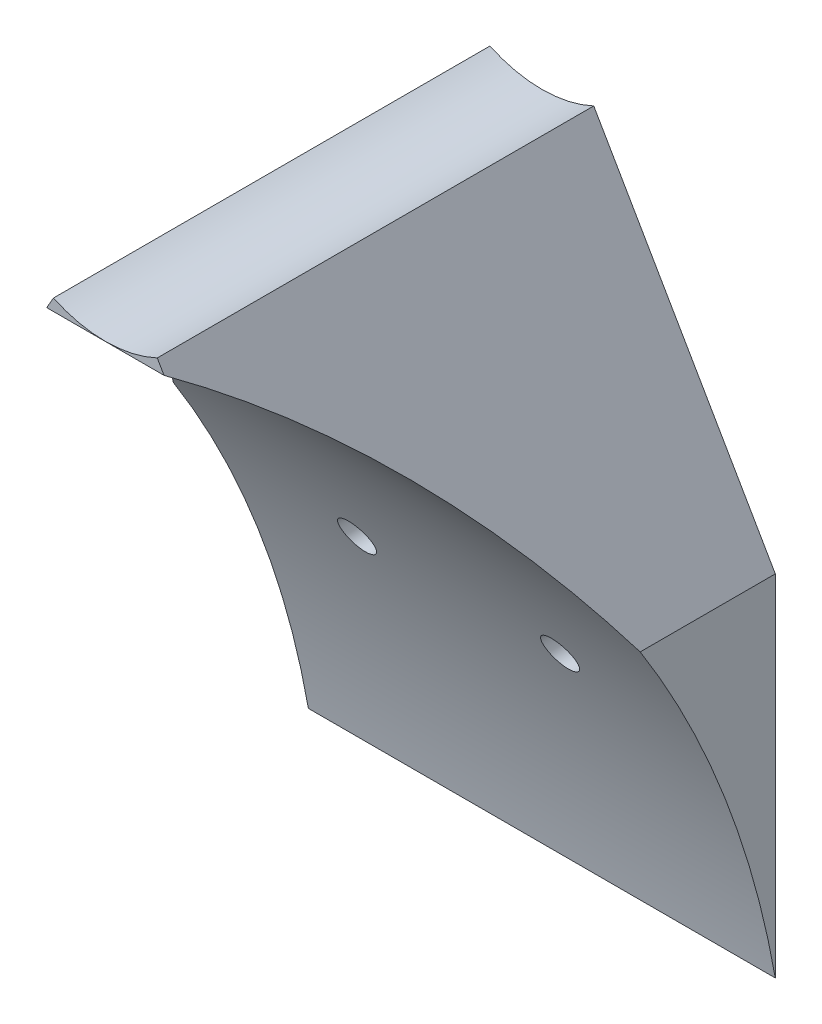
ISO-10303-21;
HEADER;
FILE_DESCRIPTION(('STEP AP214'),'2;1');
FILE_NAME('part.step','',(''),(''),'','','');
FILE_SCHEMA(('AUTOMOTIVE_DESIGN { 1 0 10303 214 1 1 1 1 }'));
ENDSEC;
DATA;
#1=APPLICATION_CONTEXT('core data for automotive mechanical design processes');
#2=APPLICATION_PROTOCOL_DEFINITION('international standard','automotive_design',2000,#1);
#3=PRODUCT_CONTEXT('',#1,'mechanical');
#4=PRODUCT('Part','Part','',(#3));
#5=PRODUCT_RELATED_PRODUCT_CATEGORY('part','',(#4));
#6=PRODUCT_DEFINITION_FORMATION('','',#4);
#7=PRODUCT_DEFINITION_CONTEXT('part definition',#1,'design');
#8=PRODUCT_DEFINITION('design','',#6,#7);
#9=PRODUCT_DEFINITION_SHAPE('','',#8);
#10=(LENGTH_UNIT() NAMED_UNIT(*) SI_UNIT(.MILLI.,.METRE.));
#11=(NAMED_UNIT(*) PLANE_ANGLE_UNIT() SI_UNIT($,.RADIAN.));
#12=(NAMED_UNIT(*) SI_UNIT($,.STERADIAN.) SOLID_ANGLE_UNIT());
#13=UNCERTAINTY_MEASURE_WITH_UNIT(LENGTH_MEASURE(1.E-05),#10,'distance_accuracy_value','');
#14=(GEOMETRIC_REPRESENTATION_CONTEXT(3) GLOBAL_UNCERTAINTY_ASSIGNED_CONTEXT((#13)) GLOBAL_UNIT_ASSIGNED_CONTEXT((#10,
#11,#12)) REPRESENTATION_CONTEXT('',''));
#15=CARTESIAN_POINT('',(0.,0.,0.));
#16=DIRECTION('',(0.,0.,1.));
#17=DIRECTION('',(1.,0.,0.));
#18=AXIS2_PLACEMENT_3D('',#15,#16,#17);
#19=CARTESIAN_POINT('',(36.5125000000001,-121.150278579952,76.2));
#20=DIRECTION('',(-1.,0.,0.));
#21=DIRECTION('',(0.,0.,1.));
#22=AXIS2_PLACEMENT_3D('',#19,#20,#21);
#23=PLANE('',#22);
#24=CARTESIAN_POINT('',(36.5125000000001,-147.643239393993,150.079588976335));
#25=DIRECTION('',(-1.,0.,0.));
#26=DIRECTION('',(0.,0.,1.));
#27=AXIS2_PLACEMENT_3D('',#24,#25,#26);
#28=CIRCLE('',#27,152.4);
#29=CARTESIAN_POINT('',(36.5125000000001,-66.4165051113586,21.1300731269984));
#30=VERTEX_POINT('',#29);
#31=CARTESIAN_POINT('',(36.5125000000001,-121.150278579952,0.));
#32=VERTEX_POINT('',#31);
#33=EDGE_CURVE('E163',#30,#32,#28,.T.);
#34=ORIENTED_EDGE('',*,*,#33,.T.);
#35=DIRECTION('',(0.,1.,0.));
#36=VECTOR('',#35,1.);
#37=CARTESIAN_POINT('',(36.5125000000001,-121.150278579952,0.));
#38=LINE('',#37,#36);
#39=CARTESIAN_POINT('',(36.5125000000001,-66.4165051113586,0.));
#40=VERTEX_POINT('',#39);
#41=EDGE_CURVE('E115',#32,#40,#38,.T.);
#42=ORIENTED_EDGE('',*,*,#41,.T.);
#43=DIRECTION('',(0.,0.,-1.));
#44=VECTOR('',#43,1.);
#45=CARTESIAN_POINT('',(36.5125000000001,-66.4165051113586,76.2));
#46=LINE('',#45,#44);
#47=EDGE_CURVE('E46',#30,#40,#46,.T.);
#48=ORIENTED_EDGE('',*,*,#47,.F.);
#49=EDGE_LOOP('',(#34,#42,#48));
#50=FACE_BOUND('',#49,.T.);
#51=ADVANCED_FACE('F33',(#50),#23,.F.);
#52=CARTESIAN_POINT('',(0.,-3.17499999999999,76.2));
#53=DIRECTION('',(-0.866025403784438,-0.500000000000001,0.));
#54=DIRECTION('',(0.500000000000001,-0.866025403784438,0.));
#55=AXIS2_PLACEMENT_3D('',#52,#53,#54);
#56=PLANE('',#55);
#57=DIRECTION('',(-0.500000000000001,0.866025403784438,0.));
#58=VECTOR('',#57,1.);
#59=CARTESIAN_POINT('',(0.,-3.17499999999999,0.));
#60=LINE('',#59,#58);
#61=CARTESIAN_POINT('',(8.11705413632897,-17.2341501719088,0.));
#62=VERTEX_POINT('',#61);
#63=EDGE_CURVE('E111',#40,#62,#60,.T.);
#64=ORIENTED_EDGE('',*,*,#63,.T.);
#65=DIRECTION('',(0.,0.,-1.));
#66=VECTOR('',#65,1.);
#67=CARTESIAN_POINT('',(8.11705413632897,-17.2341501719088,68.2635));
#68=LINE('',#67,#66);
#69=CARTESIAN_POINT('',(8.11705413632897,-17.2341501719088,68.2625));
#70=VERTEX_POINT('',#69);
#71=EDGE_CURVE('E92',#70,#62,#68,.T.);
#72=ORIENTED_EDGE('',*,*,#71,.F.);
#73=DIRECTION('',(-0.500000000000001,0.866025403784438,0.));
#74=VECTOR('',#73,1.);
#75=CARTESIAN_POINT('',(0.,-3.17499999999999,68.2625));
#76=LINE('',#75,#74);
#77=CARTESIAN_POINT('',(9.17553198935467,-19.0674875920357,68.2625));
#78=VERTEX_POINT('',#77);
#79=EDGE_CURVE('E170',#78,#70,#76,.T.);
#80=ORIENTED_EDGE('',*,*,#79,.F.);
#81=CARTESIAN_POINT('',(83.4087769034733,-147.643239393993,150.079588976335));
#82=DIRECTION('',(-0.866025403784438,-0.500000000000001,0.));
#83=DIRECTION('',(-0.500000000000001,0.866025403784438,0.));
#84=AXIS2_PLACEMENT_3D('',#81,#82,#83);
#85=ELLIPSE('',#84,175.976362048998,152.4);
#86=EDGE_CURVE('E175',#30,#78,#85,.F.);
#87=ORIENTED_EDGE('',*,*,#86,.F.);
#88=ORIENTED_EDGE('',*,*,#47,.T.);
#89=EDGE_LOOP('',(#64,#72,#80,#87,#88));
#90=FACE_BOUND('',#89,.T.);
#91=ADVANCED_FACE('F154',(#90),#56,.F.);
#92=CARTESIAN_POINT('',(0.,-3.17499999999999,76.2));
#93=DIRECTION('',(0.866025403784438,-0.500000000000001,0.));
#94=DIRECTION('',(0.500000000000001,0.866025403784438,0.));
#95=AXIS2_PLACEMENT_3D('',#92,#93,#94);
#96=PLANE('',#95);
#97=DIRECTION('',(-0.500000000000001,-0.866025403784438,0.));
#98=VECTOR('',#97,1.);
#99=CARTESIAN_POINT('',(0.,-3.17499999999999,68.2625));
#100=LINE('',#99,#98);
#101=CARTESIAN_POINT('',(-8.11705413632896,-17.2341501719088,68.2625));
#102=VERTEX_POINT('',#101);
#103=CARTESIAN_POINT('',(-9.17553198935461,-19.0674875920357,68.2625));
#104=VERTEX_POINT('',#103);
#105=EDGE_CURVE('E11',#102,#104,#100,.T.);
#106=ORIENTED_EDGE('',*,*,#105,.F.);
#107=DIRECTION('',(0.,0.,-1.));
#108=VECTOR('',#107,1.);
#109=CARTESIAN_POINT('',(-8.11705413632896,-17.2341501719088,68.2635));
#110=LINE('',#109,#108);
#111=CARTESIAN_POINT('',(-8.11705413632896,-17.2341501719088,0.));
#112=VERTEX_POINT('',#111);
#113=EDGE_CURVE('E54',#112,#102,#110,.F.);
#114=ORIENTED_EDGE('',*,*,#113,.F.);
#115=DIRECTION('',(-0.500000000000001,-0.866025403784438,0.));
#116=VECTOR('',#115,1.);
#117=CARTESIAN_POINT('',(0.,-3.17499999999999,0.));
#118=LINE('',#117,#116);
#119=CARTESIAN_POINT('',(-36.5125000000001,-66.4165051113586,0.));
#120=VERTEX_POINT('',#119);
#121=EDGE_CURVE('E103',#112,#120,#118,.T.);
#122=ORIENTED_EDGE('',*,*,#121,.T.);
#123=DIRECTION('',(0.,0.,-1.));
#124=VECTOR('',#123,1.);
#125=CARTESIAN_POINT('',(-36.5125000000001,-66.4165051113586,76.2));
#126=LINE('',#125,#124);
#127=CARTESIAN_POINT('',(-36.5125000000001,-66.4165051113586,21.1300731269984));
#128=VERTEX_POINT('',#127);
#129=EDGE_CURVE('E113',#128,#120,#126,.T.);
#130=ORIENTED_EDGE('',*,*,#129,.F.);
#131=CARTESIAN_POINT('',(-83.4087769034732,-147.643239393993,150.079588976335));
#132=DIRECTION('',(0.866025403784438,-0.500000000000001,0.));
#133=DIRECTION('',(-0.500000000000001,-0.866025403784438,0.));
#134=AXIS2_PLACEMENT_3D('',#131,#132,#133);
#135=ELLIPSE('',#134,175.976362048998,152.4);
#136=EDGE_CURVE('E166',#104,#128,#135,.F.);
#137=ORIENTED_EDGE('',*,*,#136,.F.);
#138=EDGE_LOOP('',(#106,#114,#122,#130,#137));
#139=FACE_BOUND('',#138,.T.);
#140=ADVANCED_FACE('F101',(#139),#96,.F.);
#141=CARTESIAN_POINT('',(-36.5125000000001,-66.4165051113586,76.2));
#142=DIRECTION('',(1.,0.,0.));
#143=DIRECTION('',(0.,1.,0.));
#144=AXIS2_PLACEMENT_3D('',#141,#142,#143);
#145=PLANE('',#144);
#146=CARTESIAN_POINT('',(-36.5125000000001,-147.643239393993,150.079588976335));
#147=DIRECTION('',(1.,0.,0.));
#148=DIRECTION('',(0.,1.,0.));
#149=AXIS2_PLACEMENT_3D('',#146,#147,#148);
#150=CIRCLE('',#149,152.4);
#151=CARTESIAN_POINT('',(-36.5125000000001,-121.150278579952,0.));
#152=VERTEX_POINT('',#151);
#153=EDGE_CURVE('E62',#152,#128,#150,.T.);
#154=ORIENTED_EDGE('',*,*,#153,.T.);
#155=ORIENTED_EDGE('',*,*,#129,.T.);
#156=DIRECTION('',(0.,-1.,0.));
#157=VECTOR('',#156,1.);
#158=CARTESIAN_POINT('',(-36.5125000000001,-66.4165051113586,0.));
#159=LINE('',#158,#157);
#160=EDGE_CURVE('E110',#120,#152,#159,.T.);
#161=ORIENTED_EDGE('',*,*,#160,.T.);
#162=EDGE_LOOP('',(#154,#155,#161));
#163=FACE_BOUND('',#162,.T.);
#164=ADVANCED_FACE('F151',(#163),#145,.F.);
#165=CARTESIAN_POINT('',(0.,0.,0.));
#166=DIRECTION('',(0.,0.,1.));
#167=DIRECTION('',(1.,0.,0.));
#168=AXIS2_PLACEMENT_3D('',#165,#166,#167);
#169=PLANE('',#168);
#170=CARTESIAN_POINT('',(15.875,-81.009177720799,0.));
#171=DIRECTION('',(0.,0.,-1.));
#172=DIRECTION('',(-1.,0.,0.));
#173=AXIS2_PLACEMENT_3D('',#170,#171,#172);
#174=CIRCLE('',#173,2.74999999999999);
#175=CARTESIAN_POINT('',(13.125,-81.009177720799,0.));
#176=VERTEX_POINT('',#175);
#177=EDGE_CURVE('E186',#176,#176,#174,.T.);
#178=ORIENTED_EDGE('',*,*,#177,.F.);
#179=EDGE_LOOP('',(#178));
#180=FACE_BOUND('',#179,.T.);
#181=CARTESIAN_POINT('',(-15.875,-81.009177720799,0.));
#182=DIRECTION('',(0.,0.,-1.));
#183=DIRECTION('',(-1.,0.,0.));
#184=AXIS2_PLACEMENT_3D('',#181,#182,#183);
#185=CIRCLE('',#184,2.74999999999999);
#186=CARTESIAN_POINT('',(-18.625,-81.009177720799,0.));
#187=VERTEX_POINT('',#186);
#188=EDGE_CURVE('E183',#187,#187,#185,.T.);
#189=ORIENTED_EDGE('',*,*,#188,.F.);
#190=EDGE_LOOP('',(#189));
#191=FACE_BOUND('',#190,.T.);
#192=CARTESIAN_POINT('',(0.,-38.1,0.));
#193=DIRECTION('',(0.,0.,-1.));
#194=DIRECTION('',(-1.,0.,0.));
#195=AXIS2_PLACEMENT_3D('',#192,#193,#194);
#196=CIRCLE('',#195,2.74999999999999);
#197=CARTESIAN_POINT('',(-2.74999999999999,-38.1,0.));
#198=VERTEX_POINT('',#197);
#199=EDGE_CURVE('E127',#198,#198,#196,.T.);
#200=ORIENTED_EDGE('',*,*,#199,.F.);
#201=EDGE_LOOP('',(#200));
#202=FACE_BOUND('',#201,.T.);
#203=ORIENTED_EDGE('',*,*,#121,.F.);
#204=CARTESIAN_POINT('',(0.,0.,0.));
#205=DIRECTION('',(0.,0.,-1.));
#206=DIRECTION('',(-1.,0.,0.));
#207=AXIS2_PLACEMENT_3D('',#204,#205,#206);
#208=CIRCLE('',#207,19.05);
#209=EDGE_CURVE('E89',#62,#112,#208,.T.);
#210=ORIENTED_EDGE('',*,*,#209,.F.);
#211=ORIENTED_EDGE('',*,*,#63,.F.);
#212=ORIENTED_EDGE('',*,*,#41,.F.);
#213=DIRECTION('',(1.,0.,0.));
#214=VECTOR('',#213,1.);
#215=CARTESIAN_POINT('',(36.5125000000001,-121.150278579952,0.));
#216=LINE('',#215,#214);
#217=EDGE_CURVE('E169',#152,#32,#216,.T.);
#218=ORIENTED_EDGE('',*,*,#217,.F.);
#219=ORIENTED_EDGE('',*,*,#160,.F.);
#220=EDGE_LOOP('',(#203,#210,#211,#212,#218,#219));
#221=FACE_BOUND('',#220,.T.);
#222=ADVANCED_FACE('F108',(#180,#191,#202,#221),#169,.F.);
#223=CARTESIAN_POINT('',(176.956817635201,-66.4165051113586,68.2625));
#224=DIRECTION('',(0.,0.,1.));
#225=DIRECTION('',(1.,0.,0.));
#226=AXIS2_PLACEMENT_3D('',#223,#224,#225);
#227=PLANE('',#226);
#228=CARTESIAN_POINT('',(0.,0.,68.2625));
#229=DIRECTION('',(0.,0.,1.));
#230=DIRECTION('',(1.,0.,0.));
#231=AXIS2_PLACEMENT_3D('',#228,#229,#230);
#232=CIRCLE('',#231,19.05);
#233=EDGE_CURVE('E97',#70,#102,#232,.F.);
#234=ORIENTED_EDGE('',*,*,#233,.T.);
#235=ORIENTED_EDGE('',*,*,#105,.T.);
#236=DIRECTION('',(-1.,0.,0.));
#237=VECTOR('',#236,1.);
#238=CARTESIAN_POINT('',(176.956817635201,-19.0674875920357,68.2625));
#239=LINE('',#238,#237);
#240=EDGE_CURVE('E167',#78,#104,#239,.T.);
#241=ORIENTED_EDGE('',*,*,#240,.F.);
#242=ORIENTED_EDGE('',*,*,#79,.T.);
#243=EDGE_LOOP('',(#234,#235,#241,#242));
#244=FACE_BOUND('',#243,.T.);
#245=ADVANCED_FACE('F143',(#244),#227,.T.);
#246=CARTESIAN_POINT('',(176.956817635201,-147.643239393993,150.079588976335));
#247=DIRECTION('',(-1.,0.,0.));
#248=DIRECTION('',(0.,0.,1.));
#249=AXIS2_PLACEMENT_3D('',#246,#247,#248);
#250=CYLINDRICAL_SURFACE('',#249,152.4);
#251=CARTESIAN_POINT('',(13.125,-81.009177720799,13.0187928859395));
#252=CARTESIAN_POINT('',(13.1250051602272,-81.1764447263414,12.937474192324));
#253=CARTESIAN_POINT('',(13.1402855479861,-81.3439958911441,12.8563987120067));
#254=CARTESIAN_POINT('',(13.2015044274995,-81.6749915725836,12.6969695078284));
#255=CARTESIAN_POINT('',(13.247485485127,-81.8384300601464,12.6186197219905));
#256=CARTESIAN_POINT('',(13.3699557536423,-82.1564983342417,12.4668066742483));
#257=CARTESIAN_POINT('',(13.446514583627,-82.3111070928477,12.3933550127615));
#258=CARTESIAN_POINT('',(13.6291407395705,-82.6056102791243,12.2539986776496));
#259=CARTESIAN_POINT('',(13.7351907964586,-82.7455132521435,12.1880896191143));
#260=CARTESIAN_POINT('',(13.9671340653345,-82.9966104118686,12.0702000966318));
#261=CARTESIAN_POINT('',(14.0913487274269,-83.1090604772238,12.017602455163));
#262=CARTESIAN_POINT('',(14.3608824801977,-83.3109674955961,11.9234047441348));
#263=CARTESIAN_POINT('',(14.5061866206405,-83.4004406134641,11.8817969423603));
#264=CARTESIAN_POINT('',(14.7978910379837,-83.5441462608872,11.8150891104866));
#265=CARTESIAN_POINT('',(14.9427077801259,-83.6010200454736,11.7887487519661));
#266=CARTESIAN_POINT('',(15.2413750882983,-83.6897071192458,11.7477121897863));
#267=CARTESIAN_POINT('',(15.3952202052767,-83.7215353608001,11.7330090386002));
#268=CARTESIAN_POINT('',(15.6941864770797,-83.7570189241771,11.716620038529));
#269=CARTESIAN_POINT('',(15.839014817743,-83.7627332333508,11.713982814205));
#270=CARTESIAN_POINT('',(16.1275621730502,-83.7513564096739,11.7192357991038));
#271=CARTESIAN_POINT('',(16.2712814150828,-83.7342700834861,11.7271237894778));
#272=CARTESIAN_POINT('',(16.5497040079515,-83.6788053127093,11.7527583948555));
#273=CARTESIAN_POINT('',(16.6845443855358,-83.6409887203068,11.7702448779901));
#274=CARTESIAN_POINT('',(16.9456434892909,-83.5460119554561,11.8142348331156));
#275=CARTESIAN_POINT('',(17.0719014220249,-83.4888499974648,11.8407391374369));
#276=CARTESIAN_POINT('',(17.3169076234166,-83.3551357125824,11.9028712795214));
#277=CARTESIAN_POINT('',(17.4352702952913,-83.2780054739872,11.9387714623913));
#278=CARTESIAN_POINT('',(17.6573076118338,-83.108092284273,12.0180680309599));
#279=CARTESIAN_POINT('',(17.7609780762083,-83.0153048946952,12.0614665423539));
#280=CARTESIAN_POINT('',(17.9591955989169,-82.8093388345299,12.1580924204525));
#281=CARTESIAN_POINT('',(18.0524433848766,-82.6951445837896,12.2118170271745));
#282=CARTESIAN_POINT('',(18.2185637616188,-82.4553817341678,12.3250217098061));
#283=CARTESIAN_POINT('',(18.2914285279169,-82.3298087917394,12.3845039841657));
#284=CARTESIAN_POINT('',(18.4218597193361,-82.058346464737,12.513581420441));
#285=CARTESIAN_POINT('',(18.477341962424,-81.9116571594759,12.5836015230181));
#286=CARTESIAN_POINT('',(18.5625007741562,-81.6125415145317,12.7269971369937));
#287=CARTESIAN_POINT('',(18.5921670328845,-81.4601129081208,12.8003739766426));
#288=CARTESIAN_POINT('',(18.626894213767,-81.1409256969778,12.9546966059676));
#289=CARTESIAN_POINT('',(18.6297988509287,-80.9739955486956,13.0357785846298));
#290=CARTESIAN_POINT('',(18.6054770326153,-80.6421802186206,13.1976975976831));
#291=CARTESIAN_POINT('',(18.5782412731006,-80.4772956841803,13.2785345487106));
#292=CARTESIAN_POINT('',(18.4926532721345,-80.1489000774797,13.4402509848781));
#293=CARTESIAN_POINT('',(18.4333460014251,-79.9855966306438,13.5210512752783));
#294=CARTESIAN_POINT('',(18.2837540556995,-79.6709973869575,13.6773706021433));
#295=CARTESIAN_POINT('',(18.1934708047732,-79.5197010384865,13.7528898812053));
#296=CARTESIAN_POINT('',(17.9875521529941,-79.2404207988236,13.8928133669104));
#297=CARTESIAN_POINT('',(17.8730833107884,-79.1117437351032,13.9575425892119));
#298=CARTESIAN_POINT('',(17.6191133522976,-78.8759834395422,14.0764935529413));
#299=CARTESIAN_POINT('',(17.479631206181,-78.7688839729945,14.1307231929127));
#300=CARTESIAN_POINT('',(17.1947588708706,-78.5913319432079,14.2208277291349));
#301=CARTESIAN_POINT('',(17.0514201451935,-78.5182566625177,14.258010109432));
#302=CARTESIAN_POINT('',(16.7517917541691,-78.3977149231919,14.3194255690098));
#303=CARTESIAN_POINT('',(16.5955139251308,-78.3502253516807,14.3436703353073));
#304=CARTESIAN_POINT('',(16.2931251478807,-78.2872551223172,14.3758360796656));
#305=CARTESIAN_POINT('',(16.1477807360061,-78.2688335231464,14.385256552496));
#306=CARTESIAN_POINT('',(15.8557502128362,-78.2553684734105,14.3921413562216));
#307=CARTESIAN_POINT('',(15.7090646337608,-78.2603161195067,14.3896102404963));
#308=CARTESIAN_POINT('',(15.4269967623673,-78.2924066354472,14.3732063860168));
#309=CARTESIAN_POINT('',(15.2914349229517,-78.3183213604191,14.3599612304137));
#310=CARTESIAN_POINT('',(15.0269502538136,-78.3896217621297,14.3235650463284));
#311=CARTESIAN_POINT('',(14.8980277313686,-78.4350083391494,14.3004135598271));
#312=CARTESIAN_POINT('',(14.6470185878873,-78.5446776858239,14.2445691147656));
#313=CARTESIAN_POINT('',(14.5251613208429,-78.6093762101716,14.2116663514689));
#314=CARTESIAN_POINT('',(14.29415540502,-78.7548310220394,14.1378594383212));
#315=CARTESIAN_POINT('',(14.1850099065539,-78.835591276711,14.0969533117279));
#316=CARTESIAN_POINT('',(13.9728125804757,-79.0178652028779,14.004869584336));
#317=CARTESIAN_POINT('',(13.8710092170927,-79.1205422380494,13.9531225864228));
#318=CARTESIAN_POINT('',(13.6859048497202,-79.3385955384225,13.8435785972823));
#319=CARTESIAN_POINT('',(13.6026164315007,-79.4539803627112,13.785777529752));
#320=CARTESIAN_POINT('',(13.4476728522003,-79.7072881801647,13.6593242627525));
#321=CARTESIAN_POINT('',(13.3782105639714,-79.8463021116999,13.5901724772707));
#322=CARTESIAN_POINT('',(13.2639937711492,-80.1323417168811,13.4484646904559));
#323=CARTESIAN_POINT('',(13.219220649042,-80.2793612615073,13.3759112991136));
#324=CARTESIAN_POINT('',(13.1663571670558,-80.5240921069312,13.2556457441712));
#325=CARTESIAN_POINT('',(13.1508633446931,-80.6204972734325,13.2083952904765));
#326=CARTESIAN_POINT('',(13.1301829707687,-80.8142953208923,13.1136666550406));
#327=CARTESIAN_POINT('',(13.1249969924267,-80.9116882564779,13.066188460782));
#328=CARTESIAN_POINT('',(13.125,-81.009177720799,13.0187928859395));
#329=B_SPLINE_CURVE_WITH_KNOTS('',3,(#251,#252,#253,#254,#255,#256,#257,#258,#259,#260,#261,
#262,#263,#264,#265,#266,#267,#268,#269,#270,#271,#272,#273,#274,#275,#276,#277,#278,#279,#280,
#281,#282,#283,#284,#285,#286,#287,#288,#289,#290,#291,#292,#293,#294,#295,#296,#297,#298,#299,
#300,#301,#302,#303,#304,#305,#306,#307,#308,#309,#310,#311,#312,#313,#314,#315,#316,#317,#318,
#319,#320,#321,#322,#323,#324,#325,#326,#327,#328),.UNSPECIFIED.,.T.,.F.,(4,2,2,2,2,2,2,2,2,2,2,
2,2,2,2,2,2,2,2,2,2,2,2,2,2,2,2,2,2,2,2,2,2,2,2,2,2,2,4),(0.,0.55757997581824,1.115934635067,
1.67556786300299,2.23487407609133,2.75881744995118,3.28239120057836,3.75324627191497,
4.22382002567879,4.65656725356552,5.08922326726462,5.5106944702229,5.93220458484661,
6.36763206113337,6.80318317955667,7.27196019834379,7.74091692165133,8.25399284562285,
8.76727357856659,9.32158168875467,9.87606095606221,10.448041867896,11.019996486999,
11.568932210302,12.1174533662327,12.6100625539267,13.1022259932999,13.5403749990754,
13.9783570899892,14.3923957706424,14.8064535964371,15.2301617657565,15.6539747187272,
16.1128025874718,16.5719414029982,17.080123005165,17.5879208737856,17.9128812589779,
18.2378597147255),.UNSPECIFIED.);
#330=CARTESIAN_POINT('',(13.125,-81.009177720799,13.0187928859395));
#331=VERTEX_POINT('',#330);
#332=EDGE_CURVE('E36',#331,#331,#329,.T.);
#333=ORIENTED_EDGE('',*,*,#332,.F.);
#334=EDGE_LOOP('',(#333));
#335=FACE_BOUND('',#334,.T.);
#336=CARTESIAN_POINT('',(-18.625,-81.009177720799,13.0187928859395));
#337=CARTESIAN_POINT('',(-18.6249948397729,-81.1764447263414,12.937474192324));
#338=CARTESIAN_POINT('',(-18.6097144520139,-81.3439958911441,12.8563987120067));
#339=CARTESIAN_POINT('',(-18.5484955725005,-81.6749915725836,12.6969695078284));
#340=CARTESIAN_POINT('',(-18.502514514873,-81.8384300601464,12.6186197219905));
#341=CARTESIAN_POINT('',(-18.3800442463577,-82.1564983342417,12.4668066742483));
#342=CARTESIAN_POINT('',(-18.303485416373,-82.3111070928477,12.3933550127615));
#343=CARTESIAN_POINT('',(-18.1208592604295,-82.6056102791243,12.2539986776496));
#344=CARTESIAN_POINT('',(-18.0148092035414,-82.7455132521435,12.1880896191143));
#345=CARTESIAN_POINT('',(-17.7828659346655,-82.9966104118686,12.0702000966318));
#346=CARTESIAN_POINT('',(-17.6586512725731,-83.1090604772238,12.017602455163));
#347=CARTESIAN_POINT('',(-17.3891175198023,-83.3109674955961,11.9234047441348));
#348=CARTESIAN_POINT('',(-17.2438133793595,-83.4004406134641,11.8817969423603));
#349=CARTESIAN_POINT('',(-16.9521089620163,-83.5441462608873,11.8150891104866));
#350=CARTESIAN_POINT('',(-16.8072922198741,-83.6010200454736,11.7887487519661));
#351=CARTESIAN_POINT('',(-16.5086249117017,-83.6897071192457,11.7477121897863));
#352=CARTESIAN_POINT('',(-16.3547797947233,-83.7215353608001,11.7330090386002));
#353=CARTESIAN_POINT('',(-16.0558135229203,-83.7570189241771,11.716620038529));
#354=CARTESIAN_POINT('',(-15.910985182257,-83.7627332333508,11.713982814205));
#355=CARTESIAN_POINT('',(-15.6224378269498,-83.7513564096739,11.7192357991038));
#356=CARTESIAN_POINT('',(-15.4787185849172,-83.7342700834861,11.7271237894778));
#357=CARTESIAN_POINT('',(-15.2002959920485,-83.6788053127093,11.7527583948555));
#358=CARTESIAN_POINT('',(-15.0654556144642,-83.6409887203068,11.7702448779901));
#359=CARTESIAN_POINT('',(-14.8043565107091,-83.5460119554561,11.8142348331156));
#360=CARTESIAN_POINT('',(-14.6780985779751,-83.4888499974648,11.8407391374369));
#361=CARTESIAN_POINT('',(-14.4330923765834,-83.3551357125824,11.9028712795214));
#362=CARTESIAN_POINT('',(-14.3147297047087,-83.2780054739872,11.9387714623913));
#363=CARTESIAN_POINT('',(-14.0926923881662,-83.108092284273,12.0180680309599));
#364=CARTESIAN_POINT('',(-13.9890219237917,-83.0153048946952,12.0614665423539));
#365=CARTESIAN_POINT('',(-13.7908044010831,-82.8093388345299,12.1580924204524));
#366=CARTESIAN_POINT('',(-13.6975566151234,-82.6951445837896,12.2118170271745));
#367=CARTESIAN_POINT('',(-13.5314362383812,-82.4553817341678,12.3250217098061));
#368=CARTESIAN_POINT('',(-13.4585714720831,-82.3298087917394,12.3845039841657));
#369=CARTESIAN_POINT('',(-13.3281402806639,-82.058346464737,12.513581420441));
#370=CARTESIAN_POINT('',(-13.272658037576,-81.9116571594759,12.5836015230181));
#371=CARTESIAN_POINT('',(-13.1874992258438,-81.6125415145317,12.7269971369937));
#372=CARTESIAN_POINT('',(-13.1578329671155,-81.4601129081208,12.8003739766426));
#373=CARTESIAN_POINT('',(-13.123105786233,-81.1409256969778,12.9546966059676));
#374=CARTESIAN_POINT('',(-13.1202011490713,-80.9739955486956,13.0357785846298));
#375=CARTESIAN_POINT('',(-13.1445229673847,-80.6421802186206,13.1976975976831));
#376=CARTESIAN_POINT('',(-13.1717587268994,-80.4772956841803,13.2785345487106));
#377=CARTESIAN_POINT('',(-13.2573467278655,-80.1489000774797,13.4402509848781));
#378=CARTESIAN_POINT('',(-13.3166539985749,-79.9855966306438,13.5210512752783));
#379=CARTESIAN_POINT('',(-13.4662459443005,-79.6709973869575,13.6773706021433));
#380=CARTESIAN_POINT('',(-13.5565291952268,-79.5197010384865,13.7528898812053));
#381=CARTESIAN_POINT('',(-13.7624478470059,-79.2404207988237,13.8928133669104));
#382=CARTESIAN_POINT('',(-13.8769166892116,-79.1117437351032,13.9575425892119));
#383=CARTESIAN_POINT('',(-14.1308866477024,-78.8759834395422,14.0764935529413));
#384=CARTESIAN_POINT('',(-14.270368793819,-78.7688839729946,14.1307231929127));
#385=CARTESIAN_POINT('',(-14.5552411291294,-78.5913319432079,14.2208277291349));
#386=CARTESIAN_POINT('',(-14.6985798548065,-78.5182566625177,14.2580101094319));
#387=CARTESIAN_POINT('',(-14.9982082458309,-78.397714923192,14.3194255690098));
#388=CARTESIAN_POINT('',(-15.1544860748692,-78.3502253516808,14.3436703353074));
#389=CARTESIAN_POINT('',(-15.4568748521193,-78.2872551223172,14.3758360796656));
#390=CARTESIAN_POINT('',(-15.6022192639939,-78.2688335231464,14.385256552496));
#391=CARTESIAN_POINT('',(-15.8942497871638,-78.2553684734105,14.3921413562215));
#392=CARTESIAN_POINT('',(-16.0409353662392,-78.2603161195067,14.3896102404963));
#393=CARTESIAN_POINT('',(-16.3230032376327,-78.2924066354472,14.3732063860168));
#394=CARTESIAN_POINT('',(-16.4585650770483,-78.3183213604191,14.3599612304137));
#395=CARTESIAN_POINT('',(-16.7230497461864,-78.3896217621297,14.3235650463284));
#396=CARTESIAN_POINT('',(-16.8519722686314,-78.4350083391494,14.3004135598271));
#397=CARTESIAN_POINT('',(-17.1029814121127,-78.5446776858239,14.2445691147656));
#398=CARTESIAN_POINT('',(-17.2248386791571,-78.6093762101716,14.2116663514689));
#399=CARTESIAN_POINT('',(-17.45584459498,-78.7548310220394,14.1378594383212));
#400=CARTESIAN_POINT('',(-17.5649900934461,-78.835591276711,14.0969533117279));
#401=CARTESIAN_POINT('',(-17.7771874195243,-79.0178652028779,14.004869584336));
#402=CARTESIAN_POINT('',(-17.8789907829073,-79.1205422380494,13.9531225864228));
#403=CARTESIAN_POINT('',(-18.0640951502798,-79.3385955384225,13.8435785972823));
#404=CARTESIAN_POINT('',(-18.1473835684993,-79.4539803627112,13.785777529752));
#405=CARTESIAN_POINT('',(-18.3023271477997,-79.7072881801647,13.6593242627525));
#406=CARTESIAN_POINT('',(-18.3717894360286,-79.8463021116999,13.5901724772707));
#407=CARTESIAN_POINT('',(-18.4860062288508,-80.1323417168811,13.4484646904559));
#408=CARTESIAN_POINT('',(-18.530779350958,-80.2793612615073,13.3759112991136));
#409=CARTESIAN_POINT('',(-18.5836428329442,-80.5240921069312,13.2556457441712));
#410=CARTESIAN_POINT('',(-18.5991366553069,-80.6204972734325,13.2083952904765));
#411=CARTESIAN_POINT('',(-18.6198170292313,-80.8142953208923,13.1136666550406));
#412=CARTESIAN_POINT('',(-18.6250030075733,-80.9116882564779,13.066188460782));
#413=CARTESIAN_POINT('',(-18.625,-81.009177720799,13.0187928859395));
#414=B_SPLINE_CURVE_WITH_KNOTS('',3,(#336,#337,#338,#339,#340,#341,#342,#343,#344,#345,#346,
#347,#348,#349,#350,#351,#352,#353,#354,#355,#356,#357,#358,#359,#360,#361,#362,#363,#364,#365,
#366,#367,#368,#369,#370,#371,#372,#373,#374,#375,#376,#377,#378,#379,#380,#381,#382,#383,#384,
#385,#386,#387,#388,#389,#390,#391,#392,#393,#394,#395,#396,#397,#398,#399,#400,#401,#402,#403,
#404,#405,#406,#407,#408,#409,#410,#411,#412,#413),.UNSPECIFIED.,.T.,.F.,(4,2,2,2,2,2,2,2,2,2,2,
2,2,2,2,2,2,2,2,2,2,2,2,2,2,2,2,2,2,2,2,2,2,2,2,2,2,2,4),(0.,0.55757997581824,1.115934635067,
1.67556786300299,2.23487407609133,2.75881744995119,3.28239120057838,3.75324627191498,
4.2238200256788,4.65656725356553,5.08922326726461,5.51069447022289,5.93220458484662,
6.36763206113338,6.80318317955668,7.2719601983438,7.74091692165132,8.25399284562285,
8.76727357856659,9.32158168875467,9.87606095606222,10.448041867896,11.019996486999,
11.568932210302,12.1174533662327,12.6100625539267,13.1022259932999,13.5403749990754,
13.9783570899892,14.3923957706424,14.8064535964371,15.2301617657565,15.6539747187272,
16.1128025874718,16.5719414029982,17.080123005165,17.5879208737856,17.9128812589779,
18.2378597147255),.UNSPECIFIED.);
#415=CARTESIAN_POINT('',(-18.625,-81.009177720799,13.0187928859395));
#416=VERTEX_POINT('',#415);
#417=EDGE_CURVE('E128',#416,#416,#414,.T.);
#418=ORIENTED_EDGE('',*,*,#417,.F.);
#419=EDGE_LOOP('',(#418));
#420=FACE_BOUND('',#419,.T.);
#421=CARTESIAN_POINT('',(-2.74999999999999,-38.1,44.1265866447806));
#422=CARTESIAN_POINT('',(-2.75000069094485,-38.2060226890039,44.0169718748867));
#423=CARTESIAN_POINT('',(-2.7438736403613,-38.3122479066993,43.9074769160934));
#424=CARTESIAN_POINT('',(-2.71915785494782,-38.5243735583662,43.689475239865));
#425=CARTESIAN_POINT('',(-2.70056116614475,-38.6302737416689,43.5809691980328));
#426=CARTESIAN_POINT('',(-2.65047968210899,-38.8410884665438,43.365603617584));
#427=CARTESIAN_POINT('',(-2.61897470606396,-38.9460012004138,43.2587469302451));
#428=CARTESIAN_POINT('',(-2.54255107408947,-39.1536439310445,43.0478666556793));
#429=CARTESIAN_POINT('',(-2.4976401812406,-39.2563751542931,42.9438414667306));
#430=CARTESIAN_POINT('',(-2.37559333554598,-39.4937560305678,42.7041418990787));
#431=CARTESIAN_POINT('',(-2.29268247845818,-39.627093190073,42.5700297910836));
#432=CARTESIAN_POINT('',(-2.09918300594695,-39.8837251067943,42.3128040359173));
#433=CARTESIAN_POINT('',(-1.98865369392749,-40.0070406404735,42.1896675802909));
#434=CARTESIAN_POINT('',(-1.76888346889747,-40.2095104235671,41.9881043664848));
#435=CARTESIAN_POINT('',(-1.66604223874483,-40.2920571051875,41.9061390959438));
#436=CARTESIAN_POINT('',(-1.4431925668371,-40.4447544472417,41.7548164870968));
#437=CARTESIAN_POINT('',(-1.32320568021942,-40.5149204285515,41.6854435629081));
#438=CARTESIAN_POINT('',(-1.09261694053643,-40.6261931116781,41.5755951164568));
#439=CARTESIAN_POINT('',(-0.984909060477982,-40.6703042572599,41.5321159181399));
#440=CARTESIAN_POINT('',(-0.760710285190821,-40.7453273576542,41.4582320209709));
#441=CARTESIAN_POINT('',(-0.644225278832586,-40.776248071208,41.4278186460251));
#442=CARTESIAN_POINT('',(-0.404506816689053,-40.8228408699692,41.3820105133077));
#443=CARTESIAN_POINT('',(-0.281234996276789,-40.8384142587538,41.3667129615453));
#444=CARTESIAN_POINT('',(-0.0327879140899032,-40.8526138443679,41.3527642748664));
#445=CARTESIAN_POINT('',(0.0923865895306553,-40.851246623351,41.354106674615));
#446=CARTESIAN_POINT('',(0.327191372177312,-40.8327403551875,41.3722874068925));
#447=CARTESIAN_POINT('',(0.43708757167034,-40.8172514378167,41.3875044847587));
#448=CARTESIAN_POINT('',(0.651902729010188,-40.773861631565,41.4301664555229));
#449=CARTESIAN_POINT('',(0.756821055194838,-40.7459591721172,41.457612895686));
#450=CARTESIAN_POINT('',(0.963865645270008,-40.6779529971488,41.5245805460488));
#451=CARTESIAN_POINT('',(1.06568702614615,-40.6373838965235,41.5645626141142));
#452=CARTESIAN_POINT('',(1.26030328086899,-40.5465672585292,41.6541911175146));
#453=CARTESIAN_POINT('',(1.35309313068844,-40.4963143800935,41.7038428863136));
#454=CARTESIAN_POINT('',(1.57549511465052,-40.3594703003056,41.8392715882285));
#455=CARTESIAN_POINT('',(1.69873643121248,-40.2676870469779,41.9302952238157));
#456=CARTESIAN_POINT('',(1.92295043283449,-40.0715622411712,42.1253692660866));
#457=CARTESIAN_POINT('',(2.02386847639319,-39.9671908194125,42.2294506808133));
#458=CARTESIAN_POINT('',(2.23928417350547,-39.7082211755095,42.4885259273009));
#459=CARTESIAN_POINT('',(2.3440669013013,-39.5497488070304,42.6477006343196));
#460=CARTESIAN_POINT('',(2.51661335497414,-39.2239231931329,42.97652795717));
#461=CARTESIAN_POINT('',(2.58433211950266,-39.0565594304658,43.1461930222702));
#462=CARTESIAN_POINT('',(2.66684932845367,-38.7803193682507,43.4275938962966));
#463=CARTESIAN_POINT('',(2.6919538288546,-38.6726301584967,43.5376239648191));
#464=CARTESIAN_POINT('',(2.72900639551827,-38.4564501652916,43.7591817955912));
#465=CARTESIAN_POINT('',(2.74095104142105,-38.3479591808248,43.8707099395833));
#466=CARTESIAN_POINT('',(2.75197762141206,-38.1308503113195,44.0945853080908));
#467=CARTESIAN_POINT('',(2.75104005235192,-38.0222324828615,44.2069335171103));
#468=CARTESIAN_POINT('',(2.73636538728849,-37.8057708220118,44.4315184094104));
#469=CARTESIAN_POINT('',(2.72262977115627,-37.697926901584,44.5437551040837));
#470=CARTESIAN_POINT('',(2.68213460610857,-37.4829938034201,44.7681243074359));
#471=CARTESIAN_POINT('',(2.65528552760171,-37.3759150235717,44.8802507125618));
#472=CARTESIAN_POINT('',(2.58821800331043,-37.1640636744463,45.1027566164387));
#473=CARTESIAN_POINT('',(2.54799592358209,-37.0592917402855,45.2131356318084));
#474=CARTESIAN_POINT('',(2.45379084716642,-36.8533234687207,45.4307623904296));
#475=CARTESIAN_POINT('',(2.39984504418783,-36.7521182957198,45.5380177373483));
#476=CARTESIAN_POINT('',(2.27745077210636,-36.554284659408,45.7482660110733));
#477=CARTESIAN_POINT('',(2.20901433118206,-36.4576524811071,45.8512623888681));
#478=CARTESIAN_POINT('',(2.04847459929868,-36.2603999145292,46.0620613855448));
#479=CARTESIAN_POINT('',(1.95461866289411,-36.1604662399103,46.1691917240948));
#480=CARTESIAN_POINT('',(1.74658101588541,-35.9712268574686,46.3725938367851));
#481=CARTESIAN_POINT('',(1.63242831493668,-35.8819062806356,46.4688807924421));
#482=CARTESIAN_POINT('',(1.40990971589841,-35.7360390186943,46.6264717887302));
#483=CARTESIAN_POINT('',(1.30564462707667,-35.6765838563726,46.6908359736662));
#484=CARTESIAN_POINT('',(1.0843653553312,-35.5698464782591,46.8065489716291));
#485=CARTESIAN_POINT('',(0.967368426172111,-35.5225480733739,46.8579150926875));
#486=CARTESIAN_POINT('',(0.744748578052241,-35.4506742694342,46.9360451376786));
#487=CARTESIAN_POINT('',(0.640940564989151,-35.4235283138647,46.965587013578));
#488=CARTESIAN_POINT('',(0.428062358406393,-35.3813597511158,47.0114980538872));
#489=CARTESIAN_POINT('',(0.31899602990754,-35.366328379101,47.0278767417678));
#490=CARTESIAN_POINT('',(0.0982165804017538,-35.3495186553577,47.0461941460941));
#491=CARTESIAN_POINT('',(-0.0135046607879967,-35.3477882468498,47.0480806254717));
#492=CARTESIAN_POINT('',(-0.235600903625631,-35.3578558837411,47.0371089028561));
#493=CARTESIAN_POINT('',(-0.3459757087699,-35.3696558804973,47.0242485740761));
#494=CARTESIAN_POINT('',(-0.556367896651783,-35.4048665339797,46.9859020948877));
#495=CARTESIAN_POINT('',(-0.65662483232913,-35.4276351993723,46.9611141462695));
#496=CARTESIAN_POINT('',(-0.850974667154503,-35.483022330689,46.9008732418412));
#497=CARTESIAN_POINT('',(-0.945064948692765,-35.5156449468649,46.8654157923127));
#498=CARTESIAN_POINT('',(-1.16483074875107,-35.6049756363432,46.7684404040638));
#499=CARTESIAN_POINT('',(-1.2866979278943,-35.6660091215358,46.7022718818766));
#500=CARTESIAN_POINT('',(-1.51438051437239,-35.80070873183,46.5565565897316));
#501=CARTESIAN_POINT('',(-1.62016117806242,-35.8744014879041,46.4769816239331));
#502=CARTESIAN_POINT('',(-1.85699874572766,-36.0638936353029,46.2728641378374));
#503=CARTESIAN_POINT('',(-1.98006576798991,-36.1843951344522,46.1434537867756));
#504=CARTESIAN_POINT('',(-2.19701387833324,-36.4376157770578,45.872564907428));
#505=CARTESIAN_POINT('',(-2.29082621908778,-36.5703627631938,45.7310589335737));
#506=CARTESIAN_POINT('',(-2.4262448779552,-36.8009031954058,45.486303776039));
#507=CARTESIAN_POINT('',(-2.47499948134909,-36.8966209741001,45.384954951533));
#508=CARTESIAN_POINT('',(-2.56036015754844,-37.0908796888805,45.1798474065442));
#509=CARTESIAN_POINT('',(-2.59696047241593,-37.1894219390788,45.0760875687083));
#510=CARTESIAN_POINT('',(-2.68900843196353,-37.4876556243094,44.7629719298604));
#511=CARTESIAN_POINT('',(-2.72703224712448,-37.6905337090368,44.5511640674249));
#512=CARTESIAN_POINT('',(-2.7474338450965,-37.9628878673359,44.2684819919933));
#513=CARTESIAN_POINT('',(-2.74999955294707,-38.0314015413028,44.1975092400838));
#514=CARTESIAN_POINT('',(-2.74999999999999,-38.1,44.1265866447806));
#515=B_SPLINE_CURVE_WITH_KNOTS('',3,(#421,#422,#423,#424,#425,#426,#427,#428,#429,#430,#431,
#432,#433,#434,#435,#436,#437,#438,#439,#440,#441,#442,#443,#444,#445,#446,#447,#448,#449,#450,
#451,#452,#453,#454,#455,#456,#457,#458,#459,#460,#461,#462,#463,#464,#465,#466,#467,#468,#469,
#470,#471,#472,#473,#474,#475,#476,#477,#478,#479,#480,#481,#482,#483,#484,#485,#486,#487,#488,
#489,#490,#491,#492,#493,#494,#495,#496,#497,#498,#499,#500,#501,#502,#503,#504,#505,#506,#507,
#508,#509,#510,#511,#512,#513,#514),.UNSPECIFIED.,.T.,.F.,(4,2,2,2,2,2,2,2,2,2,2,2,2,2,2,2,2,2,
2,2,2,2,2,2,2,2,2,2,2,2,2,2,2,2,2,2,2,2,2,2,2,2,2,2,2,2,4),(0.,0.457466298968354,
0.915224678620752,1.37370146506083,1.83191327072379,2.44933871239242,3.06544961892227,
3.52967455550013,3.99332093114928,4.36458101246589,4.73559418360704,5.10897801341068,
5.48221677212894,5.81675325813961,6.15133208189904,6.50003631383309,6.84893342617454,
7.38173209272034,7.9158208232283,8.65540456129185,9.39588349220093,9.86334739156904,
10.3309327602042,10.7992261119285,11.2674653204082,11.7389469962704,12.2105568961697,
12.6809020190618,13.1508582445866,13.6712994939533,14.1910027831754,14.5981538989301,
15.0047599709535,15.3372392205137,15.6694777066616,16.0029131848443,16.3363967571902,
16.652374831109,16.9684861735516,17.4204785918241,17.8734337668131,18.5162462445101,
19.1605581164828,19.6030527780161,20.0457567676525,20.928472774452,21.224461145526),.UNSPECIFIED.);
#516=CARTESIAN_POINT('',(-2.74999999999999,-38.1,44.1265866447806));
#517=VERTEX_POINT('',#516);
#518=EDGE_CURVE('E121',#517,#517,#515,.T.);
#519=ORIENTED_EDGE('',*,*,#518,.F.);
#520=EDGE_LOOP('',(#519));
#521=FACE_BOUND('',#520,.T.);
#522=ORIENTED_EDGE('',*,*,#86,.T.);
#523=ORIENTED_EDGE('',*,*,#240,.T.);
#524=ORIENTED_EDGE('',*,*,#136,.T.);
#525=ORIENTED_EDGE('',*,*,#153,.F.);
#526=ORIENTED_EDGE('',*,*,#217,.T.);
#527=ORIENTED_EDGE('',*,*,#33,.F.);
#528=EDGE_LOOP('',(#522,#523,#524,#525,#526,#527));
#529=FACE_BOUND('',#528,.T.);
#530=ADVANCED_FACE('F133',(#335,#420,#521,#529),#250,.F.);
#531=CARTESIAN_POINT('',(0.,-38.1,0.));
#532=DIRECTION('',(0.,0.,-1.));
#533=DIRECTION('',(-1.,0.,0.));
#534=AXIS2_PLACEMENT_3D('',#531,#532,#533);
#535=CYLINDRICAL_SURFACE('',#534,2.74999999999999);
#536=ORIENTED_EDGE('',*,*,#518,.T.);
#537=EDGE_LOOP('',(#536));
#538=FACE_BOUND('',#537,.T.);
#539=ORIENTED_EDGE('',*,*,#199,.T.);
#540=EDGE_LOOP('',(#539));
#541=FACE_BOUND('',#540,.T.);
#542=ADVANCED_FACE('F137',(#538,#541),#535,.F.);
#543=CARTESIAN_POINT('',(-15.875,-81.009177720799,0.));
#544=DIRECTION('',(0.,0.,-1.));
#545=DIRECTION('',(-1.,0.,0.));
#546=AXIS2_PLACEMENT_3D('',#543,#544,#545);
#547=CYLINDRICAL_SURFACE('',#546,2.74999999999999);
#548=ORIENTED_EDGE('',*,*,#417,.T.);
#549=EDGE_LOOP('',(#548));
#550=FACE_BOUND('',#549,.T.);
#551=ORIENTED_EDGE('',*,*,#188,.T.);
#552=EDGE_LOOP('',(#551));
#553=FACE_BOUND('',#552,.T.);
#554=ADVANCED_FACE('F140',(#550,#553),#547,.F.);
#555=CARTESIAN_POINT('',(15.875,-81.009177720799,0.));
#556=DIRECTION('',(0.,0.,-1.));
#557=DIRECTION('',(-1.,0.,0.));
#558=AXIS2_PLACEMENT_3D('',#555,#556,#557);
#559=CYLINDRICAL_SURFACE('',#558,2.74999999999999);
#560=ORIENTED_EDGE('',*,*,#332,.T.);
#561=EDGE_LOOP('',(#560));
#562=FACE_BOUND('',#561,.T.);
#563=ORIENTED_EDGE('',*,*,#177,.T.);
#564=EDGE_LOOP('',(#563));
#565=FACE_BOUND('',#564,.T.);
#566=ADVANCED_FACE('F212',(#562,#565),#559,.F.);
#567=CARTESIAN_POINT('',(0.,0.,68.2635));
#568=DIRECTION('',(0.,0.,-1.));
#569=DIRECTION('',(-1.,0.,0.));
#570=AXIS2_PLACEMENT_3D('',#567,#568,#569);
#571=CYLINDRICAL_SURFACE('',#570,19.05);
#572=ORIENTED_EDGE('',*,*,#71,.T.);
#573=ORIENTED_EDGE('',*,*,#209,.T.);
#574=ORIENTED_EDGE('',*,*,#113,.T.);
#575=ORIENTED_EDGE('',*,*,#233,.F.);
#576=EDGE_LOOP('',(#572,#573,#574,#575));
#577=FACE_BOUND('',#576,.T.);
#578=ADVANCED_FACE('F90',(#577),#571,.F.);
#579=CLOSED_SHELL('',(#51,#91,#140,#164,#222,#245,#530,#542,#554,#566,#578));
#580=MANIFOLD_SOLID_BREP('B2',#579);
#581=ADVANCED_BREP_SHAPE_REPRESENTATION('',(#18,#580),#14);
#582=SHAPE_DEFINITION_REPRESENTATION(#9,#581);
ENDSEC;
END-ISO-10303-21;
